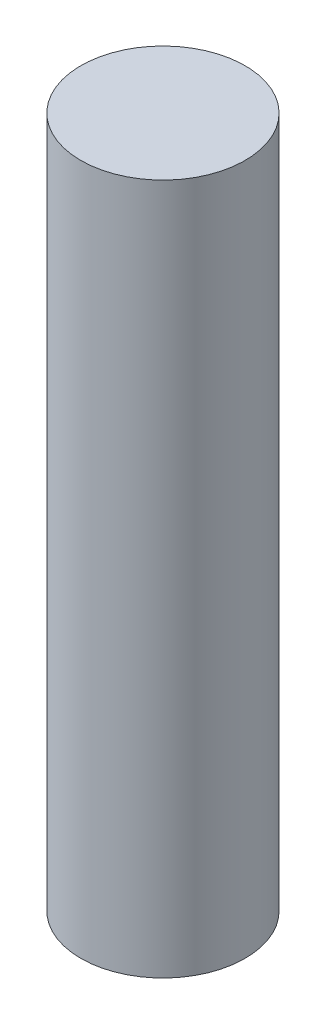
ISO-10303-21;
HEADER;
FILE_DESCRIPTION(('STEP AP214'),'2;1');
FILE_NAME('part.step','',(''),(''),'','','');
FILE_SCHEMA(('AUTOMOTIVE_DESIGN { 1 0 10303 214 1 1 1 1 }'));
ENDSEC;
DATA;
#1=APPLICATION_CONTEXT('core data for automotive mechanical design processes');
#2=APPLICATION_PROTOCOL_DEFINITION('international standard','automotive_design',2000,#1);
#3=PRODUCT_CONTEXT('',#1,'mechanical');
#4=PRODUCT('Part','Part','',(#3));
#5=PRODUCT_RELATED_PRODUCT_CATEGORY('part','',(#4));
#6=PRODUCT_DEFINITION_FORMATION('','',#4);
#7=PRODUCT_DEFINITION_CONTEXT('part definition',#1,'design');
#8=PRODUCT_DEFINITION('design','',#6,#7);
#9=PRODUCT_DEFINITION_SHAPE('','',#8);
#10=(LENGTH_UNIT() NAMED_UNIT(*) SI_UNIT(.MILLI.,.METRE.));
#11=(NAMED_UNIT(*) PLANE_ANGLE_UNIT() SI_UNIT($,.RADIAN.));
#12=(NAMED_UNIT(*) SI_UNIT($,.STERADIAN.) SOLID_ANGLE_UNIT());
#13=UNCERTAINTY_MEASURE_WITH_UNIT(LENGTH_MEASURE(1.E-05),#10,'distance_accuracy_value','');
#14=(GEOMETRIC_REPRESENTATION_CONTEXT(3) GLOBAL_UNCERTAINTY_ASSIGNED_CONTEXT((#13)) GLOBAL_UNIT_ASSIGNED_CONTEXT((#10,
#11,#12)) REPRESENTATION_CONTEXT('',''));
#15=CARTESIAN_POINT('',(0.,0.,0.));
#16=DIRECTION('',(0.,0.,1.));
#17=DIRECTION('',(1.,0.,0.));
#18=AXIS2_PLACEMENT_3D('',#15,#16,#17);
#19=CARTESIAN_POINT('',(-1.86956836129967,33.655,-3.17260085553883));
#20=DIRECTION('',(0.,-1.,0.));
#21=DIRECTION('',(0.,0.,-1.));
#22=AXIS2_PLACEMENT_3D('',#19,#20,#21);
#23=CYLINDRICAL_SURFACE('',#22,4.);
#24=CARTESIAN_POINT('',(-1.86956836129967,33.655,-3.17260085553883));
#25=DIRECTION('',(0.,1.,0.));
#26=DIRECTION('',(0.,0.,1.));
#27=AXIS2_PLACEMENT_3D('',#24,#25,#26);
#28=CIRCLE('',#27,4.);
#29=CARTESIAN_POINT('',(-1.86956836129967,33.655,0.827399144461172));
#30=VERTEX_POINT('',#29);
#31=EDGE_CURVE('E10',#30,#30,#28,.T.);
#32=ORIENTED_EDGE('',*,*,#31,.F.);
#33=EDGE_LOOP('',(#32));
#34=FACE_BOUND('',#33,.T.);
#35=CARTESIAN_POINT('',(-1.86956836129967,0.,-3.17260085553883));
#36=DIRECTION('',(0.,1.,0.));
#37=DIRECTION('',(0.,0.,1.));
#38=AXIS2_PLACEMENT_3D('',#35,#36,#37);
#39=CIRCLE('',#38,4.);
#40=CARTESIAN_POINT('',(-1.86956836129967,0.,0.827399144461172));
#41=VERTEX_POINT('',#40);
#42=EDGE_CURVE('E33',#41,#41,#39,.T.);
#43=ORIENTED_EDGE('',*,*,#42,.T.);
#44=EDGE_LOOP('',(#43));
#45=FACE_BOUND('',#44,.T.);
#46=ADVANCED_FACE('F30',(#34,#45),#23,.T.);
#47=CARTESIAN_POINT('',(-1.86956836129967,33.655,-3.17260085553883));
#48=DIRECTION('',(0.,1.,0.));
#49=DIRECTION('',(0.,0.,1.));
#50=AXIS2_PLACEMENT_3D('',#47,#48,#49);
#51=PLANE('',#50);
#52=ORIENTED_EDGE('',*,*,#31,.T.);
#53=EDGE_LOOP('',(#52));
#54=FACE_BOUND('',#53,.T.);
#55=ADVANCED_FACE('F45',(#54),#51,.T.);
#56=CARTESIAN_POINT('',(-1.86956836129967,0.,-3.17260085553883));
#57=DIRECTION('',(0.,1.,0.));
#58=DIRECTION('',(0.,0.,1.));
#59=AXIS2_PLACEMENT_3D('',#56,#57,#58);
#60=PLANE('',#59);
#61=ORIENTED_EDGE('',*,*,#42,.F.);
#62=EDGE_LOOP('',(#61));
#63=FACE_BOUND('',#62,.T.);
#64=ADVANCED_FACE('F43',(#63),#60,.F.);
#65=CLOSED_SHELL('',(#46,#55,#64));
#66=MANIFOLD_SOLID_BREP('B2',#65);
#67=ADVANCED_BREP_SHAPE_REPRESENTATION('',(#18,#66),#14);
#68=SHAPE_DEFINITION_REPRESENTATION(#9,#67);
ENDSEC;
END-ISO-10303-21;
